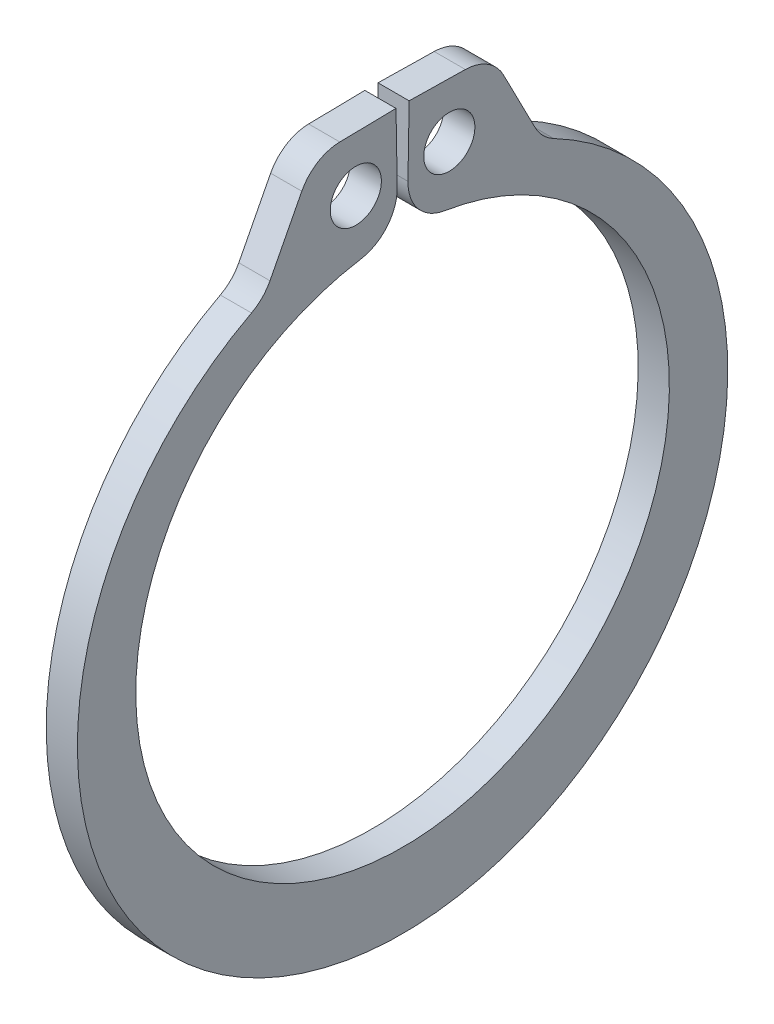
ISO-10303-21;
HEADER;
FILE_DESCRIPTION(('STEP AP214'),'2;1');
FILE_NAME('part.step','',(''),(''),'','','');
FILE_SCHEMA(('AUTOMOTIVE_DESIGN { 1 0 10303 214 1 1 1 1 }'));
ENDSEC;
DATA;
#1=APPLICATION_CONTEXT('core data for automotive mechanical design processes');
#2=APPLICATION_PROTOCOL_DEFINITION('international standard','automotive_design',2000,#1);
#3=PRODUCT_CONTEXT('',#1,'mechanical');
#4=PRODUCT('Part','Part','',(#3));
#5=PRODUCT_RELATED_PRODUCT_CATEGORY('part','',(#4));
#6=PRODUCT_DEFINITION_FORMATION('','',#4);
#7=PRODUCT_DEFINITION_CONTEXT('part definition',#1,'design');
#8=PRODUCT_DEFINITION('design','',#6,#7);
#9=PRODUCT_DEFINITION_SHAPE('','',#8);
#10=(LENGTH_UNIT() NAMED_UNIT(*) SI_UNIT(.MILLI.,.METRE.));
#11=(NAMED_UNIT(*) PLANE_ANGLE_UNIT() SI_UNIT($,.RADIAN.));
#12=(NAMED_UNIT(*) SI_UNIT($,.STERADIAN.) SOLID_ANGLE_UNIT());
#13=UNCERTAINTY_MEASURE_WITH_UNIT(LENGTH_MEASURE(1.E-05),#10,'distance_accuracy_value','');
#14=(GEOMETRIC_REPRESENTATION_CONTEXT(3) GLOBAL_UNCERTAINTY_ASSIGNED_CONTEXT((#13)) GLOBAL_UNIT_ASSIGNED_CONTEXT((#10,
#11,#12)) REPRESENTATION_CONTEXT('',''));
#15=CARTESIAN_POINT('',(0.,0.,0.));
#16=DIRECTION('',(0.,0.,1.));
#17=DIRECTION('',(1.,0.,0.));
#18=AXIS2_PLACEMENT_3D('',#15,#16,#17);
#19=CARTESIAN_POINT('',(0.3175,-0.334384540394774,0.));
#20=DIRECTION('',(1.,0.,0.));
#21=DIRECTION('',(0.,0.,-1.));
#22=AXIS2_PLACEMENT_3D('',#19,#20,#21);
#23=PLANE('',#22);
#24=CARTESIAN_POINT('',(0.3175,6.53757330882313,0.952441447944894));
#25=DIRECTION('',(1.,0.,0.));
#26=DIRECTION('',(0.,0.,-1.));
#27=AXIS2_PLACEMENT_3D('',#24,#25,#26);
#28=CIRCLE('',#27,0.5207);
#29=CARTESIAN_POINT('',(0.3175,6.53757330882313,0.431741447944894));
#30=VERTEX_POINT('',#29);
#31=EDGE_CURVE('E176',#30,#30,#28,.T.);
#32=ORIENTED_EDGE('',*,*,#31,.F.);
#33=EDGE_LOOP('',(#32));
#34=FACE_BOUND('',#33,.T.);
#35=DIRECTION('',(0.,0.888758027198477,0.458376667262058));
#36=VECTOR('',#35,1.);
#37=CARTESIAN_POINT('',(0.3175,7.64037448585418,-1.81001859545929));
#38=LINE('',#37,#36);
#39=CARTESIAN_POINT('',(0.3175,5.91184475207108,-2.70150725085));
#40=VERTEX_POINT('',#39);
#41=CARTESIAN_POINT('',(0.3175,7.16827724391611,-2.05350259645932));
#42=VERTEX_POINT('',#41);
#43=EDGE_CURVE('E182',#40,#42,#38,.T.);
#44=ORIENTED_EDGE('',*,*,#43,.T.);
#45=CARTESIAN_POINT('',(0.3175,6.76078038672014,-1.26339671027988));
#46=DIRECTION('',(1.,0.,0.));
#47=DIRECTION('',(0.,0.,-1.));
#48=AXIS2_PLACEMENT_3D('',#45,#46,#47);
#49=CIRCLE('',#48,0.889);
#50=CARTESIAN_POINT('',(0.3175,7.64964498771417,-1.27891189960262));
#51=VERTEX_POINT('',#50);
#52=EDGE_CURVE('E221',#42,#51,#49,.T.);
#53=ORIENTED_EDGE('',*,*,#52,.T.);
#54=DIRECTION('',(0.,0.0174524064372833,0.999847695156391));
#55=VECTOR('',#54,1.);
#56=CARTESIAN_POINT('',(0.3175,7.66963170000564,-0.133873919299114));
#57=LINE('',#56,#55);
#58=CARTESIAN_POINT('',(0.3175,7.66963170000564,-0.133873919299114));
#59=VERTEX_POINT('',#58);
#60=EDGE_CURVE('E185',#51,#59,#57,.T.);
#61=ORIENTED_EDGE('',*,*,#60,.T.);
#62=DIRECTION('',(0.,-0.999847695156391,0.0174524064372838));
#63=VECTOR('',#62,1.);
#64=CARTESIAN_POINT('',(0.3175,5.43477213179208,-0.0948643004304975));
#65=LINE('',#64,#63);
#66=CARTESIAN_POINT('',(0.3175,6.26085467403146,-0.109283624841353));
#67=VERTEX_POINT('',#66);
#68=EDGE_CURVE('E153',#59,#67,#65,.T.);
#69=ORIENTED_EDGE('',*,*,#68,.T.);
#70=CARTESIAN_POINT('',(0.3175,6.24533948470871,-0.998148225835385));
#71=DIRECTION('',(1.,0.,0.));
#72=DIRECTION('',(0.,0.,-1.));
#73=AXIS2_PLACEMENT_3D('',#70,#71,#72);
#74=CIRCLE('',#73,0.889);
#75=CARTESIAN_POINT('',(0.3175,5.36748052099464,-0.857846266380612));
#76=VERTEX_POINT('',#75);
#77=EDGE_CURVE('E219',#67,#76,#74,.T.);
#78=ORIENTED_EDGE('',*,*,#77,.T.);
#79=CARTESIAN_POINT('',(0.3175,0.,0.));
#80=DIRECTION('',(-1.,0.,0.));
#81=DIRECTION('',(0.,0.,-1.));
#82=AXIS2_PLACEMENT_3D('',#79,#80,#81);
#83=CIRCLE('',#82,5.4356);
#84=CARTESIAN_POINT('',(0.3175,5.36748052099464,0.857846266380612));
#85=VERTEX_POINT('',#84);
#86=EDGE_CURVE('E188',#76,#85,#83,.T.);
#87=ORIENTED_EDGE('',*,*,#86,.T.);
#88=CARTESIAN_POINT('',(0.3175,6.24533948470871,0.998148225835385));
#89=DIRECTION('',(1.,0.,0.));
#90=DIRECTION('',(0.,0.,-1.));
#91=AXIS2_PLACEMENT_3D('',#88,#89,#90);
#92=CIRCLE('',#91,0.889);
#93=CARTESIAN_POINT('',(0.3175,6.26085467403146,0.109283624841353));
#94=VERTEX_POINT('',#93);
#95=EDGE_CURVE('E217',#85,#94,#92,.T.);
#96=ORIENTED_EDGE('',*,*,#95,.T.);
#97=DIRECTION('',(0.,0.999847695156391,0.0174524064372836));
#98=VECTOR('',#97,1.);
#99=CARTESIAN_POINT('',(0.3175,5.43477213179208,0.0948643004304981));
#100=LINE('',#99,#98);
#101=CARTESIAN_POINT('',(0.3175,7.66963170000564,0.133873919299114));
#102=VERTEX_POINT('',#101);
#103=EDGE_CURVE('E191',#94,#102,#100,.T.);
#104=ORIENTED_EDGE('',*,*,#103,.T.);
#105=DIRECTION('',(0.,-0.0174524064372833,0.999847695156391));
#106=VECTOR('',#105,1.);
#107=CARTESIAN_POINT('',(0.3175,7.66963170000564,0.133873919299114));
#108=LINE('',#107,#106);
#109=CARTESIAN_POINT('',(0.3175,7.64964498771417,1.27891189960262));
#110=VERTEX_POINT('',#109);
#111=EDGE_CURVE('E193',#102,#110,#108,.T.);
#112=ORIENTED_EDGE('',*,*,#111,.T.);
#113=CARTESIAN_POINT('',(0.3175,6.76078038672014,1.26339671027988));
#114=DIRECTION('',(1.,0.,0.));
#115=DIRECTION('',(0.,0.,-1.));
#116=AXIS2_PLACEMENT_3D('',#113,#114,#115);
#117=CIRCLE('',#116,0.889);
#118=CARTESIAN_POINT('',(0.3175,7.16827724391611,2.05350259645932));
#119=VERTEX_POINT('',#118);
#120=EDGE_CURVE('E54',#110,#119,#117,.T.);
#121=ORIENTED_EDGE('',*,*,#120,.T.);
#122=DIRECTION('',(0.,-0.888758027198477,0.458376667262058));
#123=VECTOR('',#122,1.);
#124=CARTESIAN_POINT('',(0.3175,7.64037448585418,1.81001859545929));
#125=LINE('',#124,#123);
#126=CARTESIAN_POINT('',(0.3175,5.91184475207108,2.70150725085));
#127=VERTEX_POINT('',#126);
#128=EDGE_CURVE('E195',#119,#127,#125,.T.);
#129=ORIENTED_EDGE('',*,*,#128,.T.);
#130=CARTESIAN_POINT('',(0.3175,6.31934160926705,3.49161313702945));
#131=DIRECTION('',(1.,0.,0.));
#132=DIRECTION('',(0.,0.,-1.));
#133=AXIS2_PLACEMENT_3D('',#130,#131,#132);
#134=CIRCLE('',#133,0.889);
#135=CARTESIAN_POINT('',(0.3175,5.5321453172725,3.07852356094451));
#136=VERTEX_POINT('',#135);
#137=EDGE_CURVE('E11',#127,#136,#134,.F.);
#138=ORIENTED_EDGE('',*,*,#137,.T.);
#139=CARTESIAN_POINT('',(0.3175,-0.334384540394774,0.));
#140=DIRECTION('',(1.,0.,0.));
#141=DIRECTION('',(0.,0.,-1.));
#142=AXIS2_PLACEMENT_3D('',#139,#140,#141);
#143=CIRCLE('',#142,6.62521545960523);
#144=CARTESIAN_POINT('',(0.3175,5.5321453172725,-3.07852356094451));
#145=VERTEX_POINT('',#144);
#146=EDGE_CURVE('E179',#136,#145,#143,.T.);
#147=ORIENTED_EDGE('',*,*,#146,.T.);
#148=CARTESIAN_POINT('',(0.3175,6.31934160926705,-3.49161313702944));
#149=DIRECTION('',(1.,0.,0.));
#150=DIRECTION('',(0.,0.,-1.));
#151=AXIS2_PLACEMENT_3D('',#148,#149,#150);
#152=CIRCLE('',#151,0.889);
#153=EDGE_CURVE('E241',#145,#40,#152,.F.);
#154=ORIENTED_EDGE('',*,*,#153,.T.);
#155=EDGE_LOOP('',(#44,#53,#61,#69,#78,#87,#96,#104,#112,#121,#129,#138,#147,#154));
#156=FACE_BOUND('',#155,.T.);
#157=CARTESIAN_POINT('',(0.3175,6.53757330882313,-0.952441447944894));
#158=DIRECTION('',(1.,0.,0.));
#159=DIRECTION('',(0.,0.,-1.));
#160=AXIS2_PLACEMENT_3D('',#157,#158,#159);
#161=CIRCLE('',#160,0.5207);
#162=CARTESIAN_POINT('',(0.3175,6.53757330882313,-1.47314144794489));
#163=VERTEX_POINT('',#162);
#164=EDGE_CURVE('E173',#163,#163,#161,.T.);
#165=ORIENTED_EDGE('',*,*,#164,.F.);
#166=EDGE_LOOP('',(#165));
#167=FACE_BOUND('',#166,.T.);
#168=ADVANCED_FACE('F32',(#34,#156,#167),#23,.T.);
#169=CARTESIAN_POINT('',(0.3175,-0.334384540394774,0.));
#170=DIRECTION('',(-1.,0.,0.));
#171=DIRECTION('',(0.,0.,1.));
#172=AXIS2_PLACEMENT_3D('',#169,#170,#171);
#173=CYLINDRICAL_SURFACE('',#172,6.62521545960523);
#174=CARTESIAN_POINT('',(-0.3175,-0.334384540394774,0.));
#175=DIRECTION('',(1.,0.,0.));
#176=DIRECTION('',(0.,0.,-1.));
#177=AXIS2_PLACEMENT_3D('',#174,#175,#176);
#178=CIRCLE('',#177,6.62521545960523);
#179=CARTESIAN_POINT('',(-0.3175,5.5321453172725,3.07852356094451));
#180=VERTEX_POINT('',#179);
#181=CARTESIAN_POINT('',(-0.3175,5.5321453172725,-3.07852356094451));
#182=VERTEX_POINT('',#181);
#183=EDGE_CURVE('E245',#180,#182,#178,.T.);
#184=ORIENTED_EDGE('',*,*,#183,.T.);
#185=DIRECTION('',(-1.,0.,0.));
#186=VECTOR('',#185,1.);
#187=CARTESIAN_POINT('',(0.3175,5.5321453172725,-3.07852356094451));
#188=LINE('',#187,#186);
#189=EDGE_CURVE('E206',#182,#145,#188,.F.);
#190=ORIENTED_EDGE('',*,*,#189,.T.);
#191=ORIENTED_EDGE('',*,*,#146,.F.);
#192=DIRECTION('',(-1.,0.,0.));
#193=VECTOR('',#192,1.);
#194=CARTESIAN_POINT('',(0.3175,5.5321453172725,3.07852356094451));
#195=LINE('',#194,#193);
#196=EDGE_CURVE('E203',#136,#180,#195,.T.);
#197=ORIENTED_EDGE('',*,*,#196,.T.);
#198=EDGE_LOOP('',(#184,#190,#191,#197));
#199=FACE_BOUND('',#198,.T.);
#200=ADVANCED_FACE('F255',(#199),#173,.T.);
#201=CARTESIAN_POINT('',(0.3175,7.64037448585418,-1.81001859545929));
#202=DIRECTION('',(0.,-0.458376667262058,0.888758027198477));
#203=DIRECTION('',(0.,-0.888758027198477,-0.458376667262058));
#204=AXIS2_PLACEMENT_3D('',#201,#202,#203);
#205=PLANE('',#204);
#206=ORIENTED_EDGE('',*,*,#43,.F.);
#207=DIRECTION('',(1.,0.,0.));
#208=VECTOR('',#207,1.);
#209=CARTESIAN_POINT('',(-0.3175,5.91184475207108,-2.70150725085));
#210=LINE('',#209,#208);
#211=CARTESIAN_POINT('',(-0.3175,5.91184475207108,-2.70150725085));
#212=VERTEX_POINT('',#211);
#213=EDGE_CURVE('E200',#40,#212,#210,.F.);
#214=ORIENTED_EDGE('',*,*,#213,.T.);
#215=DIRECTION('',(0.,0.888758027198477,0.458376667262058));
#216=VECTOR('',#215,1.);
#217=CARTESIAN_POINT('',(-0.3175,7.64037448585418,-1.81001859545929));
#218=LINE('',#217,#216);
#219=CARTESIAN_POINT('',(-0.3175,7.16827724391611,-2.05350259645932));
#220=VERTEX_POINT('',#219);
#221=EDGE_CURVE('E146',#212,#220,#218,.T.);
#222=ORIENTED_EDGE('',*,*,#221,.T.);
#223=DIRECTION('',(-1.,0.,0.));
#224=VECTOR('',#223,1.);
#225=CARTESIAN_POINT('',(0.3175,7.16827724391611,-2.05350259645932));
#226=LINE('',#225,#224);
#227=EDGE_CURVE('E154',#220,#42,#226,.F.);
#228=ORIENTED_EDGE('',*,*,#227,.T.);
#229=EDGE_LOOP('',(#206,#214,#222,#228));
#230=FACE_BOUND('',#229,.T.);
#231=ADVANCED_FACE('F263',(#230),#205,.F.);
#232=CARTESIAN_POINT('',(0.3175,7.66963170000564,-0.133873919299114));
#233=DIRECTION('',(0.,-0.999847695156391,0.0174524064372833));
#234=DIRECTION('',(0.,-0.0174524064372833,-0.999847695156391));
#235=AXIS2_PLACEMENT_3D('',#232,#233,#234);
#236=PLANE('',#235);
#237=ORIENTED_EDGE('',*,*,#60,.F.);
#238=DIRECTION('',(-1.,0.,0.));
#239=VECTOR('',#238,1.);
#240=CARTESIAN_POINT('',(0.3175,7.64964498771417,-1.27891189960262));
#241=LINE('',#240,#239);
#242=CARTESIAN_POINT('',(-0.3175,7.64964498771417,-1.27891189960262));
#243=VERTEX_POINT('',#242);
#244=EDGE_CURVE('E142',#51,#243,#241,.T.);
#245=ORIENTED_EDGE('',*,*,#244,.T.);
#246=DIRECTION('',(0.,0.0174524064372833,0.999847695156391));
#247=VECTOR('',#246,1.);
#248=CARTESIAN_POINT('',(-0.3175,7.66963170000564,-0.133873919299114));
#249=LINE('',#248,#247);
#250=CARTESIAN_POINT('',(-0.3175,7.66963170000564,-0.133873919299114));
#251=VERTEX_POINT('',#250);
#252=EDGE_CURVE('E135',#243,#251,#249,.T.);
#253=ORIENTED_EDGE('',*,*,#252,.T.);
#254=DIRECTION('',(-1.,0.,0.));
#255=VECTOR('',#254,1.);
#256=CARTESIAN_POINT('',(0.3175,7.66963170000564,-0.133873919299114));
#257=LINE('',#256,#255);
#258=EDGE_CURVE('E139',#59,#251,#257,.T.);
#259=ORIENTED_EDGE('',*,*,#258,.F.);
#260=EDGE_LOOP('',(#237,#245,#253,#259));
#261=FACE_BOUND('',#260,.T.);
#262=ADVANCED_FACE('F138',(#261),#236,.F.);
#263=CARTESIAN_POINT('',(0.3175,5.43477213179208,-0.0948643004304975));
#264=DIRECTION('',(0.,-0.0174524064372838,-0.999847695156391));
#265=DIRECTION('',(0.,0.999847695156391,-0.0174524064372838));
#266=AXIS2_PLACEMENT_3D('',#263,#264,#265);
#267=PLANE('',#266);
#268=DIRECTION('',(0.,-0.999847695156391,0.0174524064372838));
#269=VECTOR('',#268,1.);
#270=CARTESIAN_POINT('',(-0.3175,5.43477213179208,-0.0948643004304975));
#271=LINE('',#270,#269);
#272=CARTESIAN_POINT('',(-0.3175,6.26085467403146,-0.109283624841353));
#273=VERTEX_POINT('',#272);
#274=EDGE_CURVE('E145',#251,#273,#271,.T.);
#275=ORIENTED_EDGE('',*,*,#274,.T.);
#276=DIRECTION('',(-1.,0.,0.));
#277=VECTOR('',#276,1.);
#278=CARTESIAN_POINT('',(0.3175,6.26085467403146,-0.109283624841353));
#279=LINE('',#278,#277);
#280=EDGE_CURVE('E228',#273,#67,#279,.F.);
#281=ORIENTED_EDGE('',*,*,#280,.T.);
#282=ORIENTED_EDGE('',*,*,#68,.F.);
#283=ORIENTED_EDGE('',*,*,#258,.T.);
#284=EDGE_LOOP('',(#275,#281,#282,#283));
#285=FACE_BOUND('',#284,.T.);
#286=ADVANCED_FACE('F150',(#285),#267,.F.);
#287=CARTESIAN_POINT('',(0.3175,0.,0.));
#288=DIRECTION('',(-1.,0.,0.));
#289=DIRECTION('',(0.,0.,1.));
#290=AXIS2_PLACEMENT_3D('',#287,#288,#289);
#291=CYLINDRICAL_SURFACE('',#290,5.4356);
#292=ORIENTED_EDGE('',*,*,#86,.F.);
#293=DIRECTION('',(-1.,0.,0.));
#294=VECTOR('',#293,1.);
#295=CARTESIAN_POINT('',(0.3175,5.36748052099464,-0.857846266380612));
#296=LINE('',#295,#294);
#297=CARTESIAN_POINT('',(-0.3175,5.36748052099464,-0.857846266380612));
#298=VERTEX_POINT('',#297);
#299=EDGE_CURVE('E225',#76,#298,#296,.T.);
#300=ORIENTED_EDGE('',*,*,#299,.T.);
#301=CARTESIAN_POINT('',(-0.3175,0.,0.));
#302=DIRECTION('',(-1.,0.,0.));
#303=DIRECTION('',(0.,0.,-1.));
#304=AXIS2_PLACEMENT_3D('',#301,#302,#303);
#305=CIRCLE('',#304,5.4356);
#306=CARTESIAN_POINT('',(-0.3175,5.36748052099464,0.857846266380612));
#307=VERTEX_POINT('',#306);
#308=EDGE_CURVE('E160',#298,#307,#305,.T.);
#309=ORIENTED_EDGE('',*,*,#308,.T.);
#310=DIRECTION('',(-1.,0.,0.));
#311=VECTOR('',#310,1.);
#312=CARTESIAN_POINT('',(0.3175,5.36748052099464,0.857846266380612));
#313=LINE('',#312,#311);
#314=EDGE_CURVE('E223',#307,#85,#313,.F.);
#315=ORIENTED_EDGE('',*,*,#314,.T.);
#316=EDGE_LOOP('',(#292,#300,#309,#315));
#317=FACE_BOUND('',#316,.T.);
#318=ADVANCED_FACE('F275',(#317),#291,.F.);
#319=CARTESIAN_POINT('',(0.3175,5.43477213179208,0.0948643004304981));
#320=DIRECTION('',(0.,-0.0174524064372836,0.999847695156391));
#321=DIRECTION('',(0.,-0.999847695156391,-0.0174524064372836));
#322=AXIS2_PLACEMENT_3D('',#319,#320,#321);
#323=PLANE('',#322);
#324=ORIENTED_EDGE('',*,*,#103,.F.);
#325=DIRECTION('',(-1.,0.,0.));
#326=VECTOR('',#325,1.);
#327=CARTESIAN_POINT('',(0.3175,6.26085467403146,0.109283624841353));
#328=LINE('',#327,#326);
#329=CARTESIAN_POINT('',(-0.3175,6.26085467403146,0.109283624841353));
#330=VERTEX_POINT('',#329);
#331=EDGE_CURVE('E230',#94,#330,#328,.T.);
#332=ORIENTED_EDGE('',*,*,#331,.T.);
#333=DIRECTION('',(0.,0.999847695156391,0.0174524064372836));
#334=VECTOR('',#333,1.);
#335=CARTESIAN_POINT('',(-0.3175,5.43477213179208,0.0948643004304981));
#336=LINE('',#335,#334);
#337=CARTESIAN_POINT('',(-0.3175,7.66963170000564,0.133873919299114));
#338=VERTEX_POINT('',#337);
#339=EDGE_CURVE('E163',#330,#338,#336,.T.);
#340=ORIENTED_EDGE('',*,*,#339,.T.);
#341=DIRECTION('',(-1.,0.,0.));
#342=VECTOR('',#341,1.);
#343=CARTESIAN_POINT('',(0.3175,7.66963170000564,0.133873919299114));
#344=LINE('',#343,#342);
#345=EDGE_CURVE('E155',#102,#338,#344,.T.);
#346=ORIENTED_EDGE('',*,*,#345,.F.);
#347=EDGE_LOOP('',(#324,#332,#340,#346));
#348=FACE_BOUND('',#347,.T.);
#349=ADVANCED_FACE('F285',(#348),#323,.F.);
#350=CARTESIAN_POINT('',(0.3175,7.66963170000564,0.133873919299114));
#351=DIRECTION('',(0.,-0.999847695156391,-0.0174524064372833));
#352=DIRECTION('',(0.,0.0174524064372833,-0.999847695156391));
#353=AXIS2_PLACEMENT_3D('',#350,#351,#352);
#354=PLANE('',#353);
#355=DIRECTION('',(0.,-0.0174524064372833,0.999847695156391));
#356=VECTOR('',#355,1.);
#357=CARTESIAN_POINT('',(-0.3175,7.66963170000564,0.133873919299114));
#358=LINE('',#357,#356);
#359=CARTESIAN_POINT('',(-0.3175,7.64964498771417,1.27891189960262));
#360=VERTEX_POINT('',#359);
#361=EDGE_CURVE('E168',#338,#360,#358,.T.);
#362=ORIENTED_EDGE('',*,*,#361,.T.);
#363=DIRECTION('',(-1.,0.,0.));
#364=VECTOR('',#363,1.);
#365=CARTESIAN_POINT('',(0.3175,7.64964498771417,1.27891189960262));
#366=LINE('',#365,#364);
#367=EDGE_CURVE('E237',#360,#110,#366,.F.);
#368=ORIENTED_EDGE('',*,*,#367,.T.);
#369=ORIENTED_EDGE('',*,*,#111,.F.);
#370=ORIENTED_EDGE('',*,*,#345,.T.);
#371=EDGE_LOOP('',(#362,#368,#369,#370));
#372=FACE_BOUND('',#371,.T.);
#373=ADVANCED_FACE('F292',(#372),#354,.F.);
#374=CARTESIAN_POINT('',(0.3175,7.64037448585418,1.81001859545929));
#375=DIRECTION('',(0.,-0.458376667262058,-0.888758027198477));
#376=DIRECTION('',(0.,0.888758027198477,-0.458376667262058));
#377=AXIS2_PLACEMENT_3D('',#374,#375,#376);
#378=PLANE('',#377);
#379=ORIENTED_EDGE('',*,*,#128,.F.);
#380=DIRECTION('',(-1.,0.,0.));
#381=VECTOR('',#380,1.);
#382=CARTESIAN_POINT('',(0.3175,7.16827724391611,2.05350259645932));
#383=LINE('',#382,#381);
#384=CARTESIAN_POINT('',(-0.3175,7.16827724391611,2.05350259645932));
#385=VERTEX_POINT('',#384);
#386=EDGE_CURVE('E234',#119,#385,#383,.T.);
#387=ORIENTED_EDGE('',*,*,#386,.T.);
#388=DIRECTION('',(0.,-0.888758027198477,0.458376667262058));
#389=VECTOR('',#388,1.);
#390=CARTESIAN_POINT('',(-0.3175,7.64037448585418,1.81001859545929));
#391=LINE('',#390,#389);
#392=CARTESIAN_POINT('',(-0.3175,5.91184475207108,2.70150725085));
#393=VERTEX_POINT('',#392);
#394=EDGE_CURVE('E171',#385,#393,#391,.T.);
#395=ORIENTED_EDGE('',*,*,#394,.T.);
#396=DIRECTION('',(1.,0.,0.));
#397=VECTOR('',#396,1.);
#398=CARTESIAN_POINT('',(0.3175,5.91184475207108,2.70150725085));
#399=LINE('',#398,#397);
#400=EDGE_CURVE('E47',#393,#127,#399,.T.);
#401=ORIENTED_EDGE('',*,*,#400,.T.);
#402=EDGE_LOOP('',(#379,#387,#395,#401));
#403=FACE_BOUND('',#402,.T.);
#404=ADVANCED_FACE('F248',(#403),#378,.F.);
#405=CARTESIAN_POINT('',(0.3175,6.53757330882313,0.952441447944894));
#406=DIRECTION('',(-1.,0.,0.));
#407=DIRECTION('',(0.,0.,1.));
#408=AXIS2_PLACEMENT_3D('',#405,#406,#407);
#409=CYLINDRICAL_SURFACE('',#408,0.5207);
#410=ORIENTED_EDGE('',*,*,#31,.T.);
#411=EDGE_LOOP('',(#410));
#412=FACE_BOUND('',#411,.T.);
#413=CARTESIAN_POINT('',(-0.3175,6.53757330882313,0.952441447944894));
#414=DIRECTION('',(1.,0.,0.));
#415=DIRECTION('',(0.,0.,-1.));
#416=AXIS2_PLACEMENT_3D('',#413,#414,#415);
#417=CIRCLE('',#416,0.5207);
#418=CARTESIAN_POINT('',(-0.3175,6.53757330882313,0.431741447944894));
#419=VERTEX_POINT('',#418);
#420=EDGE_CURVE('E330',#419,#419,#417,.T.);
#421=ORIENTED_EDGE('',*,*,#420,.F.);
#422=EDGE_LOOP('',(#421));
#423=FACE_BOUND('',#422,.T.);
#424=ADVANCED_FACE('F299',(#412,#423),#409,.F.);
#425=CARTESIAN_POINT('',(0.3175,6.53757330882313,-0.952441447944894));
#426=DIRECTION('',(-1.,0.,0.));
#427=DIRECTION('',(0.,0.,1.));
#428=AXIS2_PLACEMENT_3D('',#425,#426,#427);
#429=CYLINDRICAL_SURFACE('',#428,0.5207);
#430=ORIENTED_EDGE('',*,*,#164,.T.);
#431=EDGE_LOOP('',(#430));
#432=FACE_BOUND('',#431,.T.);
#433=CARTESIAN_POINT('',(-0.3175,6.53757330882313,-0.952441447944894));
#434=DIRECTION('',(1.,0.,0.));
#435=DIRECTION('',(0.,0.,-1.));
#436=AXIS2_PLACEMENT_3D('',#433,#434,#435);
#437=CIRCLE('',#436,0.5207);
#438=CARTESIAN_POINT('',(-0.3175,6.53757330882313,-1.47314144794489));
#439=VERTEX_POINT('',#438);
#440=EDGE_CURVE('E327',#439,#439,#437,.T.);
#441=ORIENTED_EDGE('',*,*,#440,.F.);
#442=EDGE_LOOP('',(#441));
#443=FACE_BOUND('',#442,.T.);
#444=ADVANCED_FACE('F313',(#432,#443),#429,.F.);
#445=CARTESIAN_POINT('',(-0.3175,-0.334384540394774,0.));
#446=DIRECTION('',(1.,0.,0.));
#447=DIRECTION('',(0.,0.,-1.));
#448=AXIS2_PLACEMENT_3D('',#445,#446,#447);
#449=PLANE('',#448);
#450=ORIENTED_EDGE('',*,*,#440,.T.);
#451=EDGE_LOOP('',(#450));
#452=FACE_BOUND('',#451,.T.);
#453=ORIENTED_EDGE('',*,*,#420,.T.);
#454=EDGE_LOOP('',(#453));
#455=FACE_BOUND('',#454,.T.);
#456=ORIENTED_EDGE('',*,*,#252,.F.);
#457=CARTESIAN_POINT('',(-0.3175,6.76078038672014,-1.26339671027988));
#458=DIRECTION('',(1.,0.,0.));
#459=DIRECTION('',(0.,0.,-1.));
#460=AXIS2_PLACEMENT_3D('',#457,#458,#459);
#461=CIRCLE('',#460,0.889);
#462=EDGE_CURVE('E214',#243,#220,#461,.F.);
#463=ORIENTED_EDGE('',*,*,#462,.T.);
#464=ORIENTED_EDGE('',*,*,#221,.F.);
#465=CARTESIAN_POINT('',(-0.3175,6.31934160926705,-3.49161313702944));
#466=DIRECTION('',(1.,0.,0.));
#467=DIRECTION('',(0.,0.,-1.));
#468=AXIS2_PLACEMENT_3D('',#465,#466,#467);
#469=CIRCLE('',#468,0.889);
#470=EDGE_CURVE('E239',#212,#182,#469,.T.);
#471=ORIENTED_EDGE('',*,*,#470,.T.);
#472=ORIENTED_EDGE('',*,*,#183,.F.);
#473=CARTESIAN_POINT('',(-0.3175,6.31934160926705,3.49161313702945));
#474=DIRECTION('',(1.,0.,0.));
#475=DIRECTION('',(0.,0.,-1.));
#476=AXIS2_PLACEMENT_3D('',#473,#474,#475);
#477=CIRCLE('',#476,0.889);
#478=EDGE_CURVE('E40',#180,#393,#477,.T.);
#479=ORIENTED_EDGE('',*,*,#478,.T.);
#480=ORIENTED_EDGE('',*,*,#394,.F.);
#481=CARTESIAN_POINT('',(-0.3175,6.76078038672014,1.26339671027988));
#482=DIRECTION('',(1.,0.,0.));
#483=DIRECTION('',(0.,0.,-1.));
#484=AXIS2_PLACEMENT_3D('',#481,#482,#483);
#485=CIRCLE('',#484,0.889);
#486=EDGE_CURVE('E209',#385,#360,#485,.F.);
#487=ORIENTED_EDGE('',*,*,#486,.T.);
#488=ORIENTED_EDGE('',*,*,#361,.F.);
#489=ORIENTED_EDGE('',*,*,#339,.F.);
#490=CARTESIAN_POINT('',(-0.3175,6.24533948470871,0.998148225835385));
#491=DIRECTION('',(1.,0.,0.));
#492=DIRECTION('',(0.,0.,-1.));
#493=AXIS2_PLACEMENT_3D('',#490,#491,#492);
#494=CIRCLE('',#493,0.889);
#495=EDGE_CURVE('E211',#330,#307,#494,.F.);
#496=ORIENTED_EDGE('',*,*,#495,.T.);
#497=ORIENTED_EDGE('',*,*,#308,.F.);
#498=CARTESIAN_POINT('',(-0.3175,6.24533948470871,-0.998148225835385));
#499=DIRECTION('',(1.,0.,0.));
#500=DIRECTION('',(0.,0.,-1.));
#501=AXIS2_PLACEMENT_3D('',#498,#499,#500);
#502=CIRCLE('',#501,0.889);
#503=EDGE_CURVE('E159',#298,#273,#502,.F.);
#504=ORIENTED_EDGE('',*,*,#503,.T.);
#505=ORIENTED_EDGE('',*,*,#274,.F.);
#506=EDGE_LOOP('',(#456,#463,#464,#471,#472,#479,#480,#487,#488,#489,#496,#497,#504,#505));
#507=FACE_BOUND('',#506,.T.);
#508=ADVANCED_FACE('F157',(#452,#455,#507),#449,.F.);
#509=CARTESIAN_POINT('',(0.3175,6.31934160926705,-3.49161313702944));
#510=DIRECTION('',(-1.,0.,0.));
#511=DIRECTION('',(0.,0.,1.));
#512=AXIS2_PLACEMENT_3D('',#509,#510,#511);
#513=CYLINDRICAL_SURFACE('',#512,0.889);
#514=ORIENTED_EDGE('',*,*,#153,.F.);
#515=ORIENTED_EDGE('',*,*,#189,.F.);
#516=ORIENTED_EDGE('',*,*,#470,.F.);
#517=ORIENTED_EDGE('',*,*,#213,.F.);
#518=EDGE_LOOP('',(#514,#515,#516,#517));
#519=FACE_BOUND('',#518,.T.);
#520=ADVANCED_FACE('F258',(#519),#513,.F.);
#521=CARTESIAN_POINT('',(0.3175,6.76078038672014,-1.26339671027988));
#522=DIRECTION('',(-1.,0.,0.));
#523=DIRECTION('',(0.,0.,1.));
#524=AXIS2_PLACEMENT_3D('',#521,#522,#523);
#525=CYLINDRICAL_SURFACE('',#524,0.889);
#526=ORIENTED_EDGE('',*,*,#52,.F.);
#527=ORIENTED_EDGE('',*,*,#227,.F.);
#528=ORIENTED_EDGE('',*,*,#462,.F.);
#529=ORIENTED_EDGE('',*,*,#244,.F.);
#530=EDGE_LOOP('',(#526,#527,#528,#529));
#531=FACE_BOUND('',#530,.T.);
#532=ADVANCED_FACE('F268',(#531),#525,.T.);
#533=CARTESIAN_POINT('',(0.3175,6.24533948470871,-0.998148225835385));
#534=DIRECTION('',(-1.,0.,0.));
#535=DIRECTION('',(0.,0.,1.));
#536=AXIS2_PLACEMENT_3D('',#533,#534,#535);
#537=CYLINDRICAL_SURFACE('',#536,0.889);
#538=ORIENTED_EDGE('',*,*,#77,.F.);
#539=ORIENTED_EDGE('',*,*,#280,.F.);
#540=ORIENTED_EDGE('',*,*,#503,.F.);
#541=ORIENTED_EDGE('',*,*,#299,.F.);
#542=EDGE_LOOP('',(#538,#539,#540,#541));
#543=FACE_BOUND('',#542,.T.);
#544=ADVANCED_FACE('F273',(#543),#537,.T.);
#545=CARTESIAN_POINT('',(0.3175,6.24533948470871,0.998148225835385));
#546=DIRECTION('',(-1.,0.,0.));
#547=DIRECTION('',(0.,0.,1.));
#548=AXIS2_PLACEMENT_3D('',#545,#546,#547);
#549=CYLINDRICAL_SURFACE('',#548,0.889);
#550=ORIENTED_EDGE('',*,*,#95,.F.);
#551=ORIENTED_EDGE('',*,*,#314,.F.);
#552=ORIENTED_EDGE('',*,*,#495,.F.);
#553=ORIENTED_EDGE('',*,*,#331,.F.);
#554=EDGE_LOOP('',(#550,#551,#552,#553));
#555=FACE_BOUND('',#554,.T.);
#556=ADVANCED_FACE('F282',(#555),#549,.T.);
#557=CARTESIAN_POINT('',(0.3175,6.76078038672014,1.26339671027988));
#558=DIRECTION('',(-1.,0.,0.));
#559=DIRECTION('',(0.,0.,1.));
#560=AXIS2_PLACEMENT_3D('',#557,#558,#559);
#561=CYLINDRICAL_SURFACE('',#560,0.889);
#562=ORIENTED_EDGE('',*,*,#120,.F.);
#563=ORIENTED_EDGE('',*,*,#367,.F.);
#564=ORIENTED_EDGE('',*,*,#486,.F.);
#565=ORIENTED_EDGE('',*,*,#386,.F.);
#566=EDGE_LOOP('',(#562,#563,#564,#565));
#567=FACE_BOUND('',#566,.T.);
#568=ADVANCED_FACE('F291',(#567),#561,.T.);
#569=CARTESIAN_POINT('',(0.3175,6.31934160926705,3.49161313702945));
#570=DIRECTION('',(-1.,0.,0.));
#571=DIRECTION('',(0.,0.,1.));
#572=AXIS2_PLACEMENT_3D('',#569,#570,#571);
#573=CYLINDRICAL_SURFACE('',#572,0.889);
#574=ORIENTED_EDGE('',*,*,#137,.F.);
#575=ORIENTED_EDGE('',*,*,#400,.F.);
#576=ORIENTED_EDGE('',*,*,#478,.F.);
#577=ORIENTED_EDGE('',*,*,#196,.F.);
#578=EDGE_LOOP('',(#574,#575,#576,#577));
#579=FACE_BOUND('',#578,.T.);
#580=ADVANCED_FACE('F34',(#579),#573,.F.);
#581=CLOSED_SHELL('',(#168,#200,#231,#262,#286,#318,#349,#373,#404,#424,#444,#508,#520,#532,
#544,#556,#568,#580));
#582=MANIFOLD_SOLID_BREP('B2',#581);
#583=ADVANCED_BREP_SHAPE_REPRESENTATION('',(#18,#582),#14);
#584=SHAPE_DEFINITION_REPRESENTATION(#9,#583);
ENDSEC;
END-ISO-10303-21;
